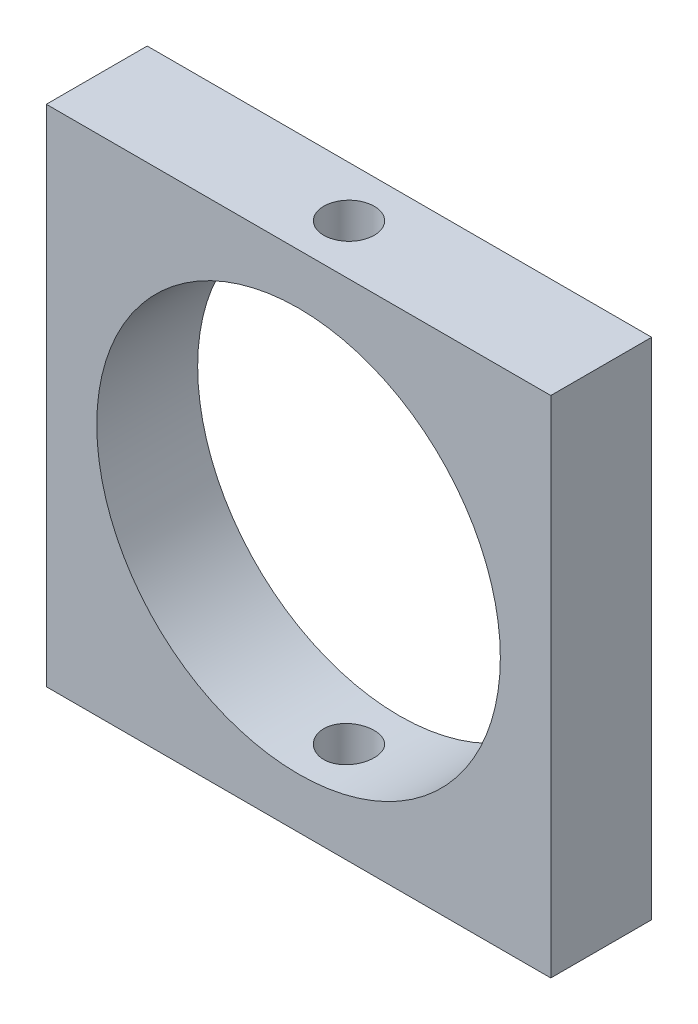
ISO-10303-21;
HEADER;
FILE_DESCRIPTION(('STEP AP214'),'2;1');
FILE_NAME('part.step','',(''),(''),'','','');
FILE_SCHEMA(('AUTOMOTIVE_DESIGN { 1 0 10303 214 1 1 1 1 }'));
ENDSEC;
DATA;
#1=APPLICATION_CONTEXT('core data for automotive mechanical design processes');
#2=APPLICATION_PROTOCOL_DEFINITION('international standard','automotive_design',2000,#1);
#3=PRODUCT_CONTEXT('',#1,'mechanical');
#4=PRODUCT('Part','Part','',(#3));
#5=PRODUCT_RELATED_PRODUCT_CATEGORY('part','',(#4));
#6=PRODUCT_DEFINITION_FORMATION('','',#4);
#7=PRODUCT_DEFINITION_CONTEXT('part definition',#1,'design');
#8=PRODUCT_DEFINITION('design','',#6,#7);
#9=PRODUCT_DEFINITION_SHAPE('','',#8);
#10=(LENGTH_UNIT() NAMED_UNIT(*) SI_UNIT(.MILLI.,.METRE.));
#11=(NAMED_UNIT(*) PLANE_ANGLE_UNIT() SI_UNIT($,.RADIAN.));
#12=(NAMED_UNIT(*) SI_UNIT($,.STERADIAN.) SOLID_ANGLE_UNIT());
#13=UNCERTAINTY_MEASURE_WITH_UNIT(LENGTH_MEASURE(1.E-05),#10,'distance_accuracy_value','');
#14=(GEOMETRIC_REPRESENTATION_CONTEXT(3) GLOBAL_UNCERTAINTY_ASSIGNED_CONTEXT((#13)) GLOBAL_UNIT_ASSIGNED_CONTEXT((#10,
#11,#12)) REPRESENTATION_CONTEXT('',''));
#15=CARTESIAN_POINT('',(0.,0.,0.));
#16=DIRECTION('',(0.,0.,1.));
#17=DIRECTION('',(1.,0.,0.));
#18=AXIS2_PLACEMENT_3D('',#15,#16,#17);
#19=CARTESIAN_POINT('',(0.,0.,4.));
#20=DIRECTION('',(0.,0.,-1.));
#21=DIRECTION('',(-1.,0.,0.));
#22=AXIS2_PLACEMENT_3D('',#19,#20,#21);
#23=PLANE('',#22);
#24=DIRECTION('',(0.,1.,0.));
#25=VECTOR('',#24,1.);
#26=CARTESIAN_POINT('',(10.,-10.,4.));
#27=LINE('',#26,#25);
#28=CARTESIAN_POINT('',(10.,-10.,4.));
#29=VERTEX_POINT('',#28);
#30=CARTESIAN_POINT('',(10.,10.,4.));
#31=VERTEX_POINT('',#30);
#32=EDGE_CURVE('E91',#29,#31,#27,.T.);
#33=ORIENTED_EDGE('',*,*,#32,.T.);
#34=DIRECTION('',(-1.,0.,0.));
#35=VECTOR('',#34,1.);
#36=CARTESIAN_POINT('',(-10.,10.,4.));
#37=LINE('',#36,#35);
#38=CARTESIAN_POINT('',(-10.,10.,4.));
#39=VERTEX_POINT('',#38);
#40=EDGE_CURVE('E86',#31,#39,#37,.T.);
#41=ORIENTED_EDGE('',*,*,#40,.T.);
#42=DIRECTION('',(0.,-1.,0.));
#43=VECTOR('',#42,1.);
#44=CARTESIAN_POINT('',(-10.,-10.,4.));
#45=LINE('',#44,#43);
#46=CARTESIAN_POINT('',(-10.,-10.,4.));
#47=VERTEX_POINT('',#46);
#48=EDGE_CURVE('E89',#39,#47,#45,.T.);
#49=ORIENTED_EDGE('',*,*,#48,.T.);
#50=DIRECTION('',(1.,0.,0.));
#51=VECTOR('',#50,1.);
#52=CARTESIAN_POINT('',(-10.,-10.,4.));
#53=LINE('',#52,#51);
#54=EDGE_CURVE('E56',#47,#29,#53,.T.);
#55=ORIENTED_EDGE('',*,*,#54,.T.);
#56=EDGE_LOOP('',(#33,#41,#49,#55));
#57=FACE_BOUND('',#56,.T.);
#58=CARTESIAN_POINT('',(0.,0.,4.));
#59=DIRECTION('',(0.,0.,1.));
#60=DIRECTION('',(1.,0.,0.));
#61=AXIS2_PLACEMENT_3D('',#58,#59,#60);
#62=CIRCLE('',#61,8.);
#63=CARTESIAN_POINT('',(8.,0.,4.));
#64=VERTEX_POINT('',#63);
#65=EDGE_CURVE('E107',#64,#64,#62,.T.);
#66=ORIENTED_EDGE('',*,*,#65,.F.);
#67=EDGE_LOOP('',(#66));
#68=FACE_BOUND('',#67,.T.);
#69=ADVANCED_FACE('F32',(#57,#68),#23,.F.);
#70=CARTESIAN_POINT('',(0.,0.,0.));
#71=DIRECTION('',(0.,0.,-1.));
#72=DIRECTION('',(-1.,0.,0.));
#73=AXIS2_PLACEMENT_3D('',#70,#71,#72);
#74=PLANE('',#73);
#75=DIRECTION('',(0.,1.,0.));
#76=VECTOR('',#75,1.);
#77=CARTESIAN_POINT('',(10.,-10.,0.));
#78=LINE('',#77,#76);
#79=CARTESIAN_POINT('',(10.,-10.,0.));
#80=VERTEX_POINT('',#79);
#81=CARTESIAN_POINT('',(10.,10.,0.));
#82=VERTEX_POINT('',#81);
#83=EDGE_CURVE('E104',#80,#82,#78,.T.);
#84=ORIENTED_EDGE('',*,*,#83,.F.);
#85=DIRECTION('',(1.,0.,0.));
#86=VECTOR('',#85,1.);
#87=CARTESIAN_POINT('',(-10.,-10.,0.));
#88=LINE('',#87,#86);
#89=CARTESIAN_POINT('',(-10.,-10.,0.));
#90=VERTEX_POINT('',#89);
#91=EDGE_CURVE('E79',#90,#80,#88,.T.);
#92=ORIENTED_EDGE('',*,*,#91,.F.);
#93=DIRECTION('',(0.,-1.,0.));
#94=VECTOR('',#93,1.);
#95=CARTESIAN_POINT('',(-10.,-10.,0.));
#96=LINE('',#95,#94);
#97=CARTESIAN_POINT('',(-10.,10.,0.));
#98=VERTEX_POINT('',#97);
#99=EDGE_CURVE('E73',#98,#90,#96,.T.);
#100=ORIENTED_EDGE('',*,*,#99,.F.);
#101=DIRECTION('',(-1.,0.,0.));
#102=VECTOR('',#101,1.);
#103=CARTESIAN_POINT('',(-10.,10.,0.));
#104=LINE('',#103,#102);
#105=EDGE_CURVE('E95',#82,#98,#104,.T.);
#106=ORIENTED_EDGE('',*,*,#105,.F.);
#107=EDGE_LOOP('',(#84,#92,#100,#106));
#108=FACE_BOUND('',#107,.T.);
#109=CARTESIAN_POINT('',(0.,0.,0.));
#110=DIRECTION('',(0.,0.,1.));
#111=DIRECTION('',(1.,0.,0.));
#112=AXIS2_PLACEMENT_3D('',#109,#110,#111);
#113=CIRCLE('',#112,8.);
#114=CARTESIAN_POINT('',(8.,0.,0.));
#115=VERTEX_POINT('',#114);
#116=EDGE_CURVE('E162',#115,#115,#113,.T.);
#117=ORIENTED_EDGE('',*,*,#116,.T.);
#118=EDGE_LOOP('',(#117));
#119=FACE_BOUND('',#118,.T.);
#120=ADVANCED_FACE('F136',(#108,#119),#74,.T.);
#121=CARTESIAN_POINT('',(10.,-10.,4.));
#122=DIRECTION('',(-1.,0.,0.));
#123=DIRECTION('',(0.,0.,1.));
#124=AXIS2_PLACEMENT_3D('',#121,#122,#123);
#125=PLANE('',#124);
#126=ORIENTED_EDGE('',*,*,#83,.T.);
#127=DIRECTION('',(0.,0.,-1.));
#128=VECTOR('',#127,1.);
#129=CARTESIAN_POINT('',(10.,10.,4.));
#130=LINE('',#129,#128);
#131=EDGE_CURVE('E11',#31,#82,#130,.T.);
#132=ORIENTED_EDGE('',*,*,#131,.F.);
#133=ORIENTED_EDGE('',*,*,#32,.F.);
#134=DIRECTION('',(0.,0.,-1.));
#135=VECTOR('',#134,1.);
#136=CARTESIAN_POINT('',(10.,-10.,4.));
#137=LINE('',#136,#135);
#138=EDGE_CURVE('E100',#29,#80,#137,.T.);
#139=ORIENTED_EDGE('',*,*,#138,.T.);
#140=EDGE_LOOP('',(#126,#132,#133,#139));
#141=FACE_BOUND('',#140,.T.);
#142=ADVANCED_FACE('F34',(#141),#125,.F.);
#143=CARTESIAN_POINT('',(-10.,10.,4.));
#144=DIRECTION('',(0.,-1.,0.));
#145=DIRECTION('',(0.,0.,-1.));
#146=AXIS2_PLACEMENT_3D('',#143,#144,#145);
#147=PLANE('',#146);
#148=CARTESIAN_POINT('',(0.,10.,2.));
#149=DIRECTION('',(0.,1.,0.));
#150=DIRECTION('',(0.,0.,1.));
#151=AXIS2_PLACEMENT_3D('',#148,#149,#150);
#152=CIRCLE('',#151,1.);
#153=CARTESIAN_POINT('',(0.,10.,3.));
#154=VERTEX_POINT('',#153);
#155=EDGE_CURVE('E155',#154,#154,#152,.T.);
#156=ORIENTED_EDGE('',*,*,#155,.F.);
#157=EDGE_LOOP('',(#156));
#158=FACE_BOUND('',#157,.T.);
#159=ORIENTED_EDGE('',*,*,#105,.T.);
#160=DIRECTION('',(0.,0.,-1.));
#161=VECTOR('',#160,1.);
#162=CARTESIAN_POINT('',(-10.,10.,4.));
#163=LINE('',#162,#161);
#164=EDGE_CURVE('E47',#39,#98,#163,.T.);
#165=ORIENTED_EDGE('',*,*,#164,.F.);
#166=ORIENTED_EDGE('',*,*,#40,.F.);
#167=ORIENTED_EDGE('',*,*,#131,.T.);
#168=EDGE_LOOP('',(#159,#165,#166,#167));
#169=FACE_BOUND('',#168,.T.);
#170=ADVANCED_FACE('F94',(#158,#169),#147,.F.);
#171=CARTESIAN_POINT('',(-10.,-10.,4.));
#172=DIRECTION('',(1.,0.,0.));
#173=DIRECTION('',(0.,0.,-1.));
#174=AXIS2_PLACEMENT_3D('',#171,#172,#173);
#175=PLANE('',#174);
#176=ORIENTED_EDGE('',*,*,#99,.T.);
#177=DIRECTION('',(0.,0.,-1.));
#178=VECTOR('',#177,1.);
#179=CARTESIAN_POINT('',(-10.,-10.,4.));
#180=LINE('',#179,#178);
#181=EDGE_CURVE('E96',#47,#90,#180,.T.);
#182=ORIENTED_EDGE('',*,*,#181,.F.);
#183=ORIENTED_EDGE('',*,*,#48,.F.);
#184=ORIENTED_EDGE('',*,*,#164,.T.);
#185=EDGE_LOOP('',(#176,#182,#183,#184));
#186=FACE_BOUND('',#185,.T.);
#187=ADVANCED_FACE('F98',(#186),#175,.F.);
#188=CARTESIAN_POINT('',(-10.,-10.,4.));
#189=DIRECTION('',(0.,1.,0.));
#190=DIRECTION('',(0.,0.,1.));
#191=AXIS2_PLACEMENT_3D('',#188,#189,#190);
#192=PLANE('',#191);
#193=CARTESIAN_POINT('',(0.,-10.,2.));
#194=DIRECTION('',(0.,1.,0.));
#195=DIRECTION('',(0.,0.,1.));
#196=AXIS2_PLACEMENT_3D('',#193,#194,#195);
#197=CIRCLE('',#196,1.);
#198=CARTESIAN_POINT('',(0.,-10.,3.));
#199=VERTEX_POINT('',#198);
#200=EDGE_CURVE('E117',#199,#199,#197,.T.);
#201=ORIENTED_EDGE('',*,*,#200,.T.);
#202=EDGE_LOOP('',(#201));
#203=FACE_BOUND('',#202,.T.);
#204=ORIENTED_EDGE('',*,*,#91,.T.);
#205=ORIENTED_EDGE('',*,*,#138,.F.);
#206=ORIENTED_EDGE('',*,*,#54,.F.);
#207=ORIENTED_EDGE('',*,*,#181,.T.);
#208=EDGE_LOOP('',(#204,#205,#206,#207));
#209=FACE_BOUND('',#208,.T.);
#210=ADVANCED_FACE('F132',(#203,#209),#192,.F.);
#211=CARTESIAN_POINT('',(0.,0.,4.));
#212=DIRECTION('',(0.,0.,-1.));
#213=DIRECTION('',(-1.,0.,0.));
#214=AXIS2_PLACEMENT_3D('',#211,#212,#213);
#215=CYLINDRICAL_SURFACE('',#214,8.);
#216=CARTESIAN_POINT('',(0.,-8.,3.));
#217=CARTESIAN_POINT('',(0.0559364382223046,-7.99999921958571,2.99999762362571));
#218=CARTESIAN_POINT('',(0.111907829721099,-7.99940713821961,2.99529084833229));
#219=CARTESIAN_POINT('',(0.222293120835901,-7.99710216044544,2.97658889817168));
#220=CARTESIAN_POINT('',(0.276705332249498,-7.99538809376571,2.96258402483064));
#221=CARTESIAN_POINT('',(0.382358229925222,-7.99103224417762,2.92570494243437));
#222=CARTESIAN_POINT('',(0.433601024058455,-7.98839108582217,2.90283670327606));
#223=CARTESIAN_POINT('',(0.531511789957214,-7.98247480351239,2.84889308641208));
#224=CARTESIAN_POINT('',(0.578180544622548,-7.97919978833646,2.81781911658771));
#225=CARTESIAN_POINT('',(0.665885126772526,-7.9723612852253,2.74816322006416));
#226=CARTESIAN_POINT('',(0.70689214597485,-7.96879645876967,2.7095451482615));
#227=CARTESIAN_POINT('',(0.781861117422997,-7.961790904039,2.62597487058534));
#228=CARTESIAN_POINT('',(0.8158227105569,-7.95835018209707,2.5810223420347));
#229=CARTESIAN_POINT('',(0.875844064513575,-7.95196922247834,2.48587200897373));
#230=CARTESIAN_POINT('',(0.901876838376428,-7.94903070871164,2.43565705537282));
#231=CARTESIAN_POINT('',(0.945129230630046,-7.94400451383073,2.33152517922106));
#232=CARTESIAN_POINT('',(0.962349183226086,-7.94191680045254,2.27760839714119));
#233=CARTESIAN_POINT('',(0.987399592009905,-7.93884135841445,2.16790232176529));
#234=CARTESIAN_POINT('',(0.99527868589268,-7.93784793374698,2.11212429691832));
#235=CARTESIAN_POINT('',(1.00157421982289,-7.93705611257117,2.00002949461127));
#236=CARTESIAN_POINT('',(0.999991040400967,-7.93725766800603,1.94371273890748));
#237=CARTESIAN_POINT('',(0.987446894579161,-7.93882782147901,1.83247806910049));
#238=CARTESIAN_POINT('',(0.976539505193878,-7.94018975184131,1.77755400551989));
#239=CARTESIAN_POINT('',(0.94574015327282,-7.94391679903051,1.67032199151241));
#240=CARTESIAN_POINT('',(0.925848008700761,-7.94628193618289,1.61801409411438));
#241=CARTESIAN_POINT('',(0.87758622396466,-7.9517564634586,1.51733280039133));
#242=CARTESIAN_POINT('',(0.849193301483055,-7.95486789284578,1.46897067990041));
#243=CARTESIAN_POINT('',(0.784752587782768,-7.96148284572239,1.3776773222347));
#244=CARTESIAN_POINT('',(0.74870444643231,-7.96498638714265,1.33474633361053));
#245=CARTESIAN_POINT('',(0.669679644301512,-7.9720204395617,1.2552229157109));
#246=CARTESIAN_POINT('',(0.626656803136005,-7.97555096954756,1.21867636329361));
#247=CARTESIAN_POINT('',(0.535062867645569,-7.98221853022341,1.15331644798778));
#248=CARTESIAN_POINT('',(0.486491760527301,-7.98535556000602,1.1245031029312));
#249=CARTESIAN_POINT('',(0.385144668545393,-7.99088460887432,1.07542747181443));
#250=CARTESIAN_POINT('',(0.332367278135087,-7.99327637760615,1.05516805844751));
#251=CARTESIAN_POINT('',(0.224123176172422,-7.99704314312025,1.0238118025907));
#252=CARTESIAN_POINT('',(0.168656590652267,-7.99841818750348,1.01271453114518));
#253=CARTESIAN_POINT('',(0.0570052655653989,-7.99999038564304,1.00005703029578));
#254=CARTESIAN_POINT('',(0.000827796079442917,-8.00019534457054,0.998433603054372));
#255=CARTESIAN_POINT('',(-0.110998414598998,-7.99942535202172,1.00460309362238));
#256=CARTESIAN_POINT('',(-0.166647167025883,-7.99845042567285,1.01239581090064));
#257=CARTESIAN_POINT('',(-0.275649803088609,-7.99543507502677,1.03712388350975));
#258=CARTESIAN_POINT('',(-0.329010628169882,-7.99339816325547,1.05402910536105));
#259=CARTESIAN_POINT('',(-0.432139861943363,-7.98848689240079,1.09647098076517));
#260=CARTESIAN_POINT('',(-0.481908148586126,-7.98561250488249,1.12200792739657));
#261=CARTESIAN_POINT('',(-0.576721808274971,-7.97932729164045,1.18114125500298));
#262=CARTESIAN_POINT('',(-0.621741503977527,-7.97591377617004,1.21477851592225));
#263=CARTESIAN_POINT('',(-0.705518795850527,-7.96894056930263,1.28909979901368));
#264=CARTESIAN_POINT('',(-0.744276143334743,-7.96538087210759,1.3297841009004));
#265=CARTESIAN_POINT('',(-0.814652783527206,-7.95849242185034,1.41732296670286));
#266=CARTESIAN_POINT('',(-0.846230184227173,-7.9551650988853,1.46421133852416));
#267=CARTESIAN_POINT('',(-0.901061155777402,-7.94914164414859,1.56266329794188));
#268=CARTESIAN_POINT('',(-0.924314893491347,-7.94644549972411,1.61422679179061));
#269=CARTESIAN_POINT('',(-0.961770631546616,-7.94199940157198,1.72043012765905));
#270=CARTESIAN_POINT('',(-0.975996250982843,-7.94024698073915,1.77506153201919));
#271=CARTESIAN_POINT('',(-0.995067997547139,-7.93787966362982,1.88596099351227));
#272=CARTESIAN_POINT('',(-0.999914561014305,-7.93726471443511,1.9422289743836));
#273=CARTESIAN_POINT('',(-1.00008261443393,-7.93724350792982,2.05438757168187));
#274=CARTESIAN_POINT('',(-0.995469919079709,-7.93782889900781,2.11027809933276));
#275=CARTESIAN_POINT('',(-0.97698976193973,-7.9401244581488,2.22048285173803));
#276=CARTESIAN_POINT('',(-0.963122299162308,-7.94183462633232,2.27479707632352));
#277=CARTESIAN_POINT('',(-0.926546829475863,-7.9461844630982,2.38029878270656));
#278=CARTESIAN_POINT('',(-0.903841992388373,-7.94882379837113,2.43148737800873));
#279=CARTESIAN_POINT('',(-0.850242760860124,-7.95473513297927,2.52933866161933));
#280=CARTESIAN_POINT('',(-0.819348263803835,-7.95800714024165,2.57600129320793));
#281=CARTESIAN_POINT('',(-0.750002532506335,-7.96484241900893,2.66381249013619));
#282=CARTESIAN_POINT('',(-0.711502250309983,-7.96840748833613,2.70492218438199));
#283=CARTESIAN_POINT('',(-0.628140090787353,-7.9754113263716,2.78012273006719));
#284=CARTESIAN_POINT('',(-0.583276715656627,-7.97885006510236,2.81421192430972));
#285=CARTESIAN_POINT('',(-0.488266248341684,-7.98522822634699,2.87451414284212));
#286=CARTESIAN_POINT('',(-0.438099711838468,-7.9881657003132,2.9006967223597));
#287=CARTESIAN_POINT('',(-0.334073160920513,-7.9931905963069,2.94422849716651));
#288=CARTESIAN_POINT('',(-0.280217232348095,-7.9952789414783,2.96158729054138));
#289=CARTESIAN_POINT('',(-0.18840230878717,-7.99786688131099,2.98282373526852));
#290=CARTESIAN_POINT('',(-0.151022265406768,-7.99866290358181,2.98925557679283));
#291=CARTESIAN_POINT('',(-0.075766825284974,-7.99972972531675,2.99784449827729));
#292=CARTESIAN_POINT('',(-0.0378914321984109,-8.00000052865388,3.00000160975972));
#293=CARTESIAN_POINT('',(0.,-8.,3.));
#294=B_SPLINE_CURVE_WITH_KNOTS('',3,(#216,#217,#218,#219,#220,#221,#222,#223,#224,#225,#226,
#227,#228,#229,#230,#231,#232,#233,#234,#235,#236,#237,#238,#239,#240,#241,#242,#243,#244,#245,
#246,#247,#248,#249,#250,#251,#252,#253,#254,#255,#256,#257,#258,#259,#260,#261,#262,#263,#264,
#265,#266,#267,#268,#269,#270,#271,#272,#273,#274,#275,#276,#277,#278,#279,#280,#281,#282,#283,
#284,#285,#286,#287,#288,#289,#290,#291,#292,#293),.UNSPECIFIED.,.T.,.F.,(4,2,2,2,2,2,2,2,2,2,2,
2,2,2,2,2,2,2,2,2,2,2,2,2,2,2,2,2,2,2,2,2,2,2,2,2,2,2,4),(0.,0.167670909110499,
0.335516984377371,0.503250203272708,0.670954662364292,0.839483252807372,1.00802043120004,
1.17712500127548,1.34622315798723,1.51443690114528,1.68264387953866,1.84989078576677,
2.01714108066497,2.18485370514213,2.35257400205455,2.52145391254567,2.69033421245245,
2.85927118292642,3.02820024361512,3.19600111756768,3.36379841800771,3.53104421557358,
3.69829569231579,3.86640961171369,4.03453020550035,4.20360788603029,4.37268217688615,
4.5413122971237,4.70993457204249,4.87738760480886,5.04484065551819,5.21223369882595,
5.37962883964906,5.54814095076732,5.71669279388005,5.88588561214741,6.05489399473613,
6.16847537275052,6.28205591320175),.UNSPECIFIED.);
#295=CARTESIAN_POINT('',(0.,-8.,3.));
#296=VERTEX_POINT('',#295);
#297=EDGE_CURVE('E36',#296,#296,#294,.T.);
#298=ORIENTED_EDGE('',*,*,#297,.F.);
#299=EDGE_LOOP('',(#298));
#300=FACE_BOUND('',#299,.T.);
#301=CARTESIAN_POINT('',(0.,8.,3.));
#302=CARTESIAN_POINT('',(-0.0559364382223045,7.99999921958571,2.99999762362571));
#303=CARTESIAN_POINT('',(-0.111907829721099,7.99940713821961,2.99529084833229));
#304=CARTESIAN_POINT('',(-0.222293120835901,7.99710216044544,2.97658889817168));
#305=CARTESIAN_POINT('',(-0.276705332249498,7.99538809376572,2.96258402483064));
#306=CARTESIAN_POINT('',(-0.382358229925222,7.99103224417762,2.92570494243437));
#307=CARTESIAN_POINT('',(-0.433601024058455,7.98839108582217,2.90283670327606));
#308=CARTESIAN_POINT('',(-0.531511789957214,7.98247480351239,2.84889308641208));
#309=CARTESIAN_POINT('',(-0.578180544622548,7.97919978833646,2.81781911658771));
#310=CARTESIAN_POINT('',(-0.665885126772526,7.9723612852253,2.74816322006416));
#311=CARTESIAN_POINT('',(-0.70689214597485,7.96879645876967,2.7095451482615));
#312=CARTESIAN_POINT('',(-0.781861117422997,7.961790904039,2.62597487058534));
#313=CARTESIAN_POINT('',(-0.8158227105569,7.95835018209707,2.5810223420347));
#314=CARTESIAN_POINT('',(-0.875844064513575,7.95196922247834,2.48587200897373));
#315=CARTESIAN_POINT('',(-0.901876838376428,7.94903070871164,2.43565705537282));
#316=CARTESIAN_POINT('',(-0.945129230630046,7.94400451383073,2.33152517922106));
#317=CARTESIAN_POINT('',(-0.962349183226086,7.94191680045254,2.27760839714119));
#318=CARTESIAN_POINT('',(-0.987399592009905,7.93884135841445,2.16790232176529));
#319=CARTESIAN_POINT('',(-0.99527868589268,7.93784793374698,2.11212429691832));
#320=CARTESIAN_POINT('',(-1.00157421982289,7.93705611257117,2.00002949461127));
#321=CARTESIAN_POINT('',(-0.999991040400967,7.93725766800603,1.94371273890748));
#322=CARTESIAN_POINT('',(-0.987446894579162,7.93882782147901,1.83247806910049));
#323=CARTESIAN_POINT('',(-0.976539505193879,7.94018975184131,1.7775540055199));
#324=CARTESIAN_POINT('',(-0.945740153272821,7.94391679903051,1.67032199151241));
#325=CARTESIAN_POINT('',(-0.925848008700761,7.94628193618289,1.61801409411438));
#326=CARTESIAN_POINT('',(-0.87758622396466,7.9517564634586,1.51733280039133));
#327=CARTESIAN_POINT('',(-0.849193301483055,7.95486789284578,1.46897067990041));
#328=CARTESIAN_POINT('',(-0.784752587782768,7.96148284572239,1.3776773222347));
#329=CARTESIAN_POINT('',(-0.748704446432311,7.96498638714265,1.33474633361053));
#330=CARTESIAN_POINT('',(-0.669679644301512,7.9720204395617,1.2552229157109));
#331=CARTESIAN_POINT('',(-0.626656803136005,7.97555096954756,1.21867636329361));
#332=CARTESIAN_POINT('',(-0.53506286764557,7.98221853022341,1.15331644798778));
#333=CARTESIAN_POINT('',(-0.486491760527301,7.98535556000602,1.1245031029312));
#334=CARTESIAN_POINT('',(-0.385144668545393,7.99088460887432,1.07542747181443));
#335=CARTESIAN_POINT('',(-0.332367278135087,7.99327637760615,1.05516805844751));
#336=CARTESIAN_POINT('',(-0.224123176172423,7.99704314312025,1.0238118025907));
#337=CARTESIAN_POINT('',(-0.168656590652267,7.99841818750348,1.01271453114518));
#338=CARTESIAN_POINT('',(-0.0570052655653993,7.99999038564304,1.00005703029578));
#339=CARTESIAN_POINT('',(-0.000827796079443079,8.00019534457054,0.998433603054372));
#340=CARTESIAN_POINT('',(0.110998414598998,7.99942535202172,1.00460309362238));
#341=CARTESIAN_POINT('',(0.166647167025882,7.99845042567285,1.01239581090064));
#342=CARTESIAN_POINT('',(0.275649803088608,7.99543507502677,1.03712388350975));
#343=CARTESIAN_POINT('',(0.329010628169881,7.99339816325548,1.05402910536105));
#344=CARTESIAN_POINT('',(0.432139861943362,7.98848689240079,1.09647098076517));
#345=CARTESIAN_POINT('',(0.481908148586125,7.98561250488249,1.12200792739657));
#346=CARTESIAN_POINT('',(0.57672180827497,7.97932729164045,1.18114125500298));
#347=CARTESIAN_POINT('',(0.621741503977527,7.97591377617004,1.21477851592225));
#348=CARTESIAN_POINT('',(0.705518795850527,7.96894056930262,1.28909979901368));
#349=CARTESIAN_POINT('',(0.744276143334743,7.96538087210759,1.3297841009004));
#350=CARTESIAN_POINT('',(0.814652783527206,7.95849242185034,1.41732296670286));
#351=CARTESIAN_POINT('',(0.846230184227173,7.95516509888531,1.46421133852416));
#352=CARTESIAN_POINT('',(0.901061155777402,7.94914164414859,1.56266329794188));
#353=CARTESIAN_POINT('',(0.924314893491347,7.94644549972411,1.61422679179061));
#354=CARTESIAN_POINT('',(0.961770631546616,7.94199940157198,1.72043012765904));
#355=CARTESIAN_POINT('',(0.975996250982843,7.94024698073915,1.77506153201919));
#356=CARTESIAN_POINT('',(0.995067997547138,7.93787966362982,1.88596099351227));
#357=CARTESIAN_POINT('',(0.999914561014305,7.93726471443511,1.9422289743836));
#358=CARTESIAN_POINT('',(1.00008261443393,7.93724350792982,2.05438757168187));
#359=CARTESIAN_POINT('',(0.995469919079709,7.93782889900781,2.11027809933276));
#360=CARTESIAN_POINT('',(0.97698976193973,7.94012445814881,2.22048285173803));
#361=CARTESIAN_POINT('',(0.963122299162308,7.94183462633232,2.27479707632352));
#362=CARTESIAN_POINT('',(0.926546829475863,7.9461844630982,2.38029878270656));
#363=CARTESIAN_POINT('',(0.903841992388374,7.94882379837114,2.43148737800872));
#364=CARTESIAN_POINT('',(0.850242760860124,7.95473513297928,2.52933866161932));
#365=CARTESIAN_POINT('',(0.819348263803836,7.95800714024165,2.57600129320793));
#366=CARTESIAN_POINT('',(0.750002532506336,7.96484241900893,2.66381249013619));
#367=CARTESIAN_POINT('',(0.711502250309984,7.96840748833613,2.70492218438199));
#368=CARTESIAN_POINT('',(0.628140090787354,7.9754113263716,2.78012273006719));
#369=CARTESIAN_POINT('',(0.583276715656627,7.97885006510236,2.81421192430972));
#370=CARTESIAN_POINT('',(0.488266248341685,7.98522822634699,2.87451414284212));
#371=CARTESIAN_POINT('',(0.438099711838468,7.98816570031321,2.9006967223597));
#372=CARTESIAN_POINT('',(0.334073160920513,7.9931905963069,2.94422849716651));
#373=CARTESIAN_POINT('',(0.280217232348095,7.9952789414783,2.96158729054138));
#374=CARTESIAN_POINT('',(0.18840230878717,7.99786688131098,2.98282373526852));
#375=CARTESIAN_POINT('',(0.151022265406768,7.99866290358181,2.98925557679283));
#376=CARTESIAN_POINT('',(0.0757668252849738,7.99972972531675,2.99784449827729));
#377=CARTESIAN_POINT('',(0.0378914321984109,8.00000052865388,3.00000160975972));
#378=CARTESIAN_POINT('',(0.,8.,3.));
#379=B_SPLINE_CURVE_WITH_KNOTS('',3,(#301,#302,#303,#304,#305,#306,#307,#308,#309,#310,#311,
#312,#313,#314,#315,#316,#317,#318,#319,#320,#321,#322,#323,#324,#325,#326,#327,#328,#329,#330,
#331,#332,#333,#334,#335,#336,#337,#338,#339,#340,#341,#342,#343,#344,#345,#346,#347,#348,#349,
#350,#351,#352,#353,#354,#355,#356,#357,#358,#359,#360,#361,#362,#363,#364,#365,#366,#367,#368,
#369,#370,#371,#372,#373,#374,#375,#376,#377,#378),.UNSPECIFIED.,.T.,.F.,(4,2,2,2,2,2,2,2,2,2,2,
2,2,2,2,2,2,2,2,2,2,2,2,2,2,2,2,2,2,2,2,2,2,2,2,2,2,2,4),(0.,0.167670909110499,
0.335516984377371,0.503250203272708,0.670954662364292,0.839483252807372,1.00802043120004,
1.17712500127548,1.34622315798723,1.51443690114528,1.68264387953865,1.84989078576677,
2.01714108066497,2.18485370514213,2.35257400205455,2.52145391254567,2.69033421245245,
2.85927118292642,3.02820024361512,3.19600111756769,3.36379841800771,3.53104421557358,
3.69829569231579,3.86640961171369,4.03453020550035,4.20360788603029,4.37268217688615,
4.5413122971237,4.70993457204249,4.87738760480886,5.04484065551819,5.21223369882595,
5.37962883964905,5.54814095076732,5.71669279388005,5.88588561214741,6.05489399473613,
6.16847537275051,6.28205591320175),.UNSPECIFIED.);
#380=CARTESIAN_POINT('',(0.,8.,3.));
#381=VERTEX_POINT('',#380);
#382=EDGE_CURVE('E112',#381,#381,#379,.T.);
#383=ORIENTED_EDGE('',*,*,#382,.F.);
#384=EDGE_LOOP('',(#383));
#385=FACE_BOUND('',#384,.T.);
#386=ORIENTED_EDGE('',*,*,#65,.T.);
#387=EDGE_LOOP('',(#386));
#388=FACE_BOUND('',#387,.T.);
#389=ORIENTED_EDGE('',*,*,#116,.F.);
#390=EDGE_LOOP('',(#389));
#391=FACE_BOUND('',#390,.T.);
#392=ADVANCED_FACE('F118',(#300,#385,#388,#391),#215,.F.);
#393=CARTESIAN_POINT('',(0.,-10.,2.));
#394=DIRECTION('',(0.,1.,0.));
#395=DIRECTION('',(0.,0.,1.));
#396=AXIS2_PLACEMENT_3D('',#393,#394,#395);
#397=CYLINDRICAL_SURFACE('',#396,1.);
#398=ORIENTED_EDGE('',*,*,#382,.T.);
#399=EDGE_LOOP('',(#398));
#400=FACE_BOUND('',#399,.T.);
#401=ORIENTED_EDGE('',*,*,#155,.T.);
#402=EDGE_LOOP('',(#401));
#403=FACE_BOUND('',#402,.T.);
#404=ADVANCED_FACE('F121',(#400,#403),#397,.F.);
#405=ORIENTED_EDGE('',*,*,#297,.T.);
#406=EDGE_LOOP('',(#405));
#407=FACE_BOUND('',#406,.T.);
#408=ORIENTED_EDGE('',*,*,#200,.F.);
#409=EDGE_LOOP('',(#408));
#410=FACE_BOUND('',#409,.T.);
#411=ADVANCED_FACE('F124',(#407,#410),#397,.F.);
#412=CLOSED_SHELL('',(#69,#120,#142,#170,#187,#210,#392,#404,#411));
#413=MANIFOLD_SOLID_BREP('B2',#412);
#414=ADVANCED_BREP_SHAPE_REPRESENTATION('',(#18,#413),#14);
#415=SHAPE_DEFINITION_REPRESENTATION(#9,#414);
ENDSEC;
END-ISO-10303-21;
